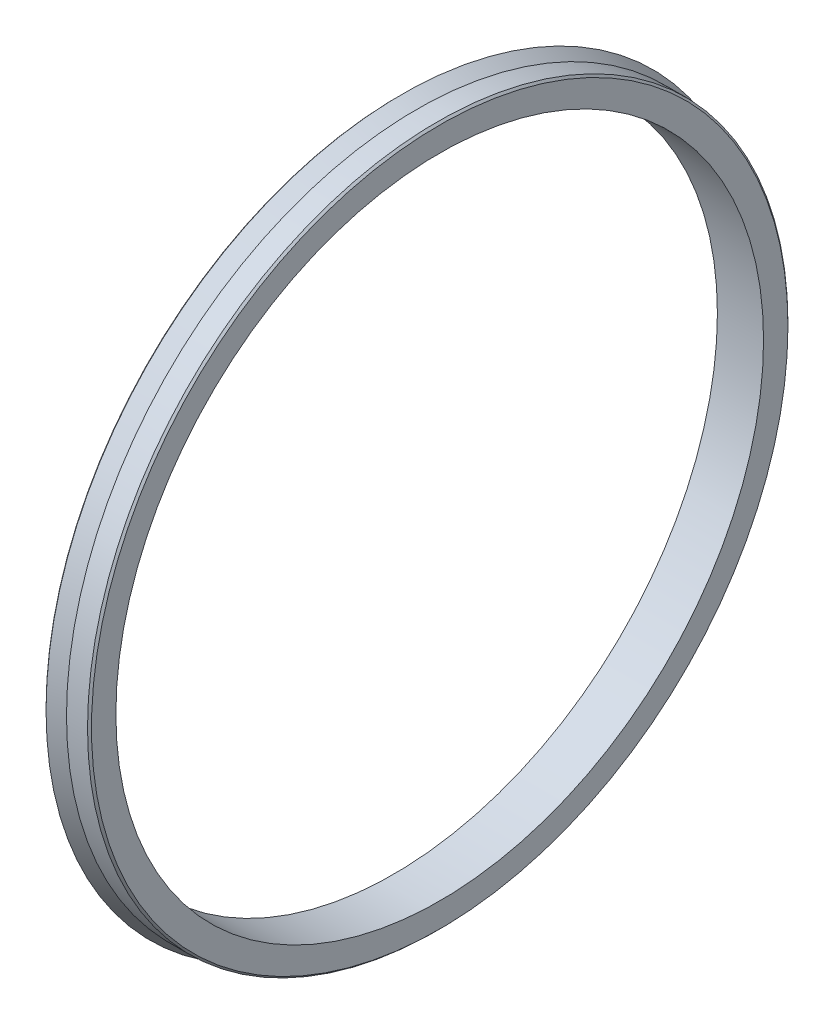
ISO-10303-21;
HEADER;
FILE_DESCRIPTION(('STEP AP214'),'2;1');
FILE_NAME('part.step','',(''),(''),'','','');
FILE_SCHEMA(('AUTOMOTIVE_DESIGN { 1 0 10303 214 1 1 1 1 }'));
ENDSEC;
DATA;
#1=APPLICATION_CONTEXT('core data for automotive mechanical design processes');
#2=APPLICATION_PROTOCOL_DEFINITION('international standard','automotive_design',2000,#1);
#3=PRODUCT_CONTEXT('',#1,'mechanical');
#4=PRODUCT('Part','Part','',(#3));
#5=PRODUCT_RELATED_PRODUCT_CATEGORY('part','',(#4));
#6=PRODUCT_DEFINITION_FORMATION('','',#4);
#7=PRODUCT_DEFINITION_CONTEXT('part definition',#1,'design');
#8=PRODUCT_DEFINITION('design','',#6,#7);
#9=PRODUCT_DEFINITION_SHAPE('','',#8);
#10=(LENGTH_UNIT() NAMED_UNIT(*) SI_UNIT(.MILLI.,.METRE.));
#11=(NAMED_UNIT(*) PLANE_ANGLE_UNIT() SI_UNIT($,.RADIAN.));
#12=(NAMED_UNIT(*) SI_UNIT($,.STERADIAN.) SOLID_ANGLE_UNIT());
#13=UNCERTAINTY_MEASURE_WITH_UNIT(LENGTH_MEASURE(1.E-05),#10,'distance_accuracy_value','');
#14=(GEOMETRIC_REPRESENTATION_CONTEXT(3) GLOBAL_UNCERTAINTY_ASSIGNED_CONTEXT((#13)) GLOBAL_UNIT_ASSIGNED_CONTEXT((#10,
#11,#12)) REPRESENTATION_CONTEXT('',''));
#15=CARTESIAN_POINT('',(0.,0.,0.));
#16=DIRECTION('',(0.,0.,1.));
#17=DIRECTION('',(1.,0.,0.));
#18=AXIS2_PLACEMENT_3D('',#15,#16,#17);
#19=CARTESIAN_POINT('',(4.,-49.11,0.));
#20=DIRECTION('',(1.,0.,0.));
#21=DIRECTION('',(0.,0.,-1.));
#22=AXIS2_PLACEMENT_3D('',#19,#20,#21);
#23=TOROIDAL_SURFACE('',#22,51.11,0.800000000000001);
#24=CARTESIAN_POINT('',(4.29203142293957,-49.11,0.));
#25=DIRECTION('',(1.,0.,0.));
#26=DIRECTION('',(0.,0.,-1.));
#27=AXIS2_PLACEMENT_3D('',#24,#25,#26);
#28=CIRCLE('',#27,51.8547936949356);
#29=CARTESIAN_POINT('',(4.29203142293957,-49.11,-51.8547936949356));
#30=VERTEX_POINT('',#29);
#31=EDGE_CURVE('E100',#30,#30,#28,.T.);
#32=ORIENTED_EDGE('',*,*,#31,.F.);
#33=EDGE_LOOP('',(#32));
#34=FACE_BOUND('',#33,.T.);
#35=CARTESIAN_POINT('',(4.,-49.11,0.));
#36=DIRECTION('',(1.,0.,0.));
#37=DIRECTION('',(0.,0.,-1.));
#38=AXIS2_PLACEMENT_3D('',#35,#36,#37);
#39=CIRCLE('',#38,50.31);
#40=CARTESIAN_POINT('',(4.,-49.11,-50.31));
#41=VERTEX_POINT('',#40);
#42=EDGE_CURVE('E72',#41,#41,#39,.T.);
#43=ORIENTED_EDGE('',*,*,#42,.T.);
#44=EDGE_LOOP('',(#43));
#45=FACE_BOUND('',#44,.T.);
#46=ADVANCED_FACE('F47',(#34,#45),#23,.F.);
#47=CARTESIAN_POINT('',(0.,-49.11,0.));
#48=DIRECTION('',(1.,0.,0.));
#49=DIRECTION('',(0.,0.,-1.));
#50=AXIS2_PLACEMENT_3D('',#47,#48,#49);
#51=CONICAL_SURFACE('',#50,50.11,0.0499583957219425);
#52=ORIENTED_EDGE('',*,*,#42,.F.);
#53=EDGE_LOOP('',(#52));
#54=FACE_BOUND('',#53,.T.);
#55=CARTESIAN_POINT('',(0.,-49.11,0.));
#56=DIRECTION('',(1.,0.,0.));
#57=DIRECTION('',(0.,0.,-1.));
#58=AXIS2_PLACEMENT_3D('',#55,#56,#57);
#59=CIRCLE('',#58,50.11);
#60=CARTESIAN_POINT('',(0.,-49.11,-50.11));
#61=VERTEX_POINT('',#60);
#62=EDGE_CURVE('E76',#61,#61,#59,.T.);
#63=ORIENTED_EDGE('',*,*,#62,.T.);
#64=EDGE_LOOP('',(#63));
#65=FACE_BOUND('',#64,.T.);
#66=ADVANCED_FACE('F110',(#54,#65),#51,.T.);
#67=CARTESIAN_POINT('',(0.,0.,0.));
#68=DIRECTION('',(1.,0.,0.));
#69=DIRECTION('',(0.,0.,-1.));
#70=AXIS2_PLACEMENT_3D('',#67,#68,#69);
#71=PLANE('',#70);
#72=ORIENTED_EDGE('',*,*,#62,.F.);
#73=EDGE_LOOP('',(#72));
#74=FACE_BOUND('',#73,.T.);
#75=CARTESIAN_POINT('',(0.,-49.11,0.));
#76=DIRECTION('',(1.,0.,0.));
#77=DIRECTION('',(0.,0.,-1.));
#78=AXIS2_PLACEMENT_3D('',#75,#76,#77);
#79=CIRCLE('',#78,49.11);
#80=CARTESIAN_POINT('',(0.,-49.11,-49.11));
#81=VERTEX_POINT('',#80);
#82=EDGE_CURVE('E80',#81,#81,#79,.T.);
#83=ORIENTED_EDGE('',*,*,#82,.T.);
#84=EDGE_LOOP('',(#83));
#85=FACE_BOUND('',#84,.T.);
#86=ADVANCED_FACE('F116',(#74,#85),#71,.F.);
#87=CARTESIAN_POINT('',(7.00000000000001,-49.11,0.));
#88=DIRECTION('',(1.,0.,0.));
#89=DIRECTION('',(0.,0.,-1.));
#90=AXIS2_PLACEMENT_3D('',#87,#88,#89);
#91=CYLINDRICAL_SURFACE('',#90,49.11);
#92=CARTESIAN_POINT('',(7.,-49.11,0.));
#93=DIRECTION('',(1.,0.,0.));
#94=DIRECTION('',(0.,0.,-1.));
#95=AXIS2_PLACEMENT_3D('',#92,#93,#94);
#96=CIRCLE('',#95,49.11);
#97=CARTESIAN_POINT('',(7.,-49.11,-49.11));
#98=VERTEX_POINT('',#97);
#99=EDGE_CURVE('E84',#98,#98,#96,.T.);
#100=ORIENTED_EDGE('',*,*,#99,.T.);
#101=EDGE_LOOP('',(#100));
#102=FACE_BOUND('',#101,.T.);
#103=ORIENTED_EDGE('',*,*,#82,.F.);
#104=EDGE_LOOP('',(#103));
#105=FACE_BOUND('',#104,.T.);
#106=ADVANCED_FACE('F122',(#102,#105),#91,.F.);
#107=CARTESIAN_POINT('',(7.,0.,0.));
#108=DIRECTION('',(1.,0.,0.));
#109=DIRECTION('',(0.,0.,-1.));
#110=AXIS2_PLACEMENT_3D('',#107,#108,#109);
#111=PLANE('',#110);
#112=CARTESIAN_POINT('',(7.,-49.11,0.));
#113=DIRECTION('',(1.,0.,0.));
#114=DIRECTION('',(0.,0.,-1.));
#115=AXIS2_PLACEMENT_3D('',#112,#113,#114);
#116=CIRCLE('',#115,52.81);
#117=CARTESIAN_POINT('',(7.,-49.11,-52.81));
#118=VERTEX_POINT('',#117);
#119=EDGE_CURVE('E66',#118,#118,#116,.T.);
#120=ORIENTED_EDGE('',*,*,#119,.T.);
#121=EDGE_LOOP('',(#120));
#122=FACE_BOUND('',#121,.T.);
#123=ORIENTED_EDGE('',*,*,#99,.F.);
#124=EDGE_LOOP('',(#123));
#125=FACE_BOUND('',#124,.T.);
#126=ADVANCED_FACE('F127',(#122,#125),#111,.T.);
#127=CARTESIAN_POINT('',(7.00000000000001,-49.11,0.));
#128=DIRECTION('',(1.,0.,0.));
#129=DIRECTION('',(0.,0.,-1.));
#130=AXIS2_PLACEMENT_3D('',#127,#128,#129);
#131=CYLINDRICAL_SURFACE('',#130,53.11);
#132=CARTESIAN_POINT('',(6.7,-49.11,0.));
#133=DIRECTION('',(1.,0.,0.));
#134=DIRECTION('',(0.,0.,-1.));
#135=AXIS2_PLACEMENT_3D('',#132,#133,#134);
#136=CIRCLE('',#135,53.11);
#137=CARTESIAN_POINT('',(6.7,-49.11,-53.11));
#138=VERTEX_POINT('',#137);
#139=EDGE_CURVE('E61',#138,#138,#136,.F.);
#140=ORIENTED_EDGE('',*,*,#139,.T.);
#141=EDGE_LOOP('',(#140));
#142=FACE_BOUND('',#141,.T.);
#143=CARTESIAN_POINT('',(3.51,-49.11,0.));
#144=DIRECTION('',(1.,0.,0.));
#145=DIRECTION('',(0.,0.,-1.));
#146=AXIS2_PLACEMENT_3D('',#143,#144,#145);
#147=CIRCLE('',#146,53.11);
#148=CARTESIAN_POINT('',(3.51,-49.11,-53.11));
#149=VERTEX_POINT('',#148);
#150=EDGE_CURVE('E88',#149,#149,#147,.T.);
#151=ORIENTED_EDGE('',*,*,#150,.T.);
#152=EDGE_LOOP('',(#151));
#153=FACE_BOUND('',#152,.T.);
#154=ADVANCED_FACE('F134',(#142,#153),#131,.T.);
#155=CARTESIAN_POINT('',(3.51,-49.11,0.));
#156=DIRECTION('',(-1.,0.,0.));
#157=DIRECTION('',(0.,0.,1.));
#158=AXIS2_PLACEMENT_3D('',#155,#156,#157);
#159=CONICAL_SURFACE('',#158,53.11,0.340750642998031);
#160=CARTESIAN_POINT('',(1.2214705882353,-49.11,0.));
#161=DIRECTION('',(1.,0.,0.));
#162=DIRECTION('',(0.,0.,-1.));
#163=AXIS2_PLACEMENT_3D('',#160,#161,#162);
#164=CIRCLE('',#163,53.9214705882353);
#165=CARTESIAN_POINT('',(1.2214705882353,-49.11,-53.9214705882353));
#166=VERTEX_POINT('',#165);
#167=EDGE_CURVE('E56',#166,#166,#164,.T.);
#168=ORIENTED_EDGE('',*,*,#167,.T.);
#169=EDGE_LOOP('',(#168));
#170=FACE_BOUND('',#169,.T.);
#171=ORIENTED_EDGE('',*,*,#150,.F.);
#172=EDGE_LOOP('',(#171));
#173=FACE_BOUND('',#172,.T.);
#174=ADVANCED_FACE('F160',(#170,#173),#159,.T.);
#175=CARTESIAN_POINT('',(1.,0.,0.));
#176=DIRECTION('',(-1.,0.,0.));
#177=DIRECTION('',(0.,0.,1.));
#178=AXIS2_PLACEMENT_3D('',#175,#176,#177);
#179=PLANE('',#178);
#180=CARTESIAN_POINT('',(1.,-49.11,0.));
#181=DIRECTION('',(-1.,0.,0.));
#182=DIRECTION('',(0.,0.,1.));
#183=AXIS2_PLACEMENT_3D('',#180,#181,#182);
#184=CIRCLE('',#183,53.7);
#185=CARTESIAN_POINT('',(1.,-49.11,-53.7));
#186=VERTEX_POINT('',#185);
#187=EDGE_CURVE('E10',#186,#186,#184,.T.);
#188=ORIENTED_EDGE('',*,*,#187,.T.);
#189=EDGE_LOOP('',(#188));
#190=FACE_BOUND('',#189,.T.);
#191=CARTESIAN_POINT('',(1.,-49.11,0.));
#192=DIRECTION('',(1.,0.,0.));
#193=DIRECTION('',(0.,0.,-1.));
#194=AXIS2_PLACEMENT_3D('',#191,#192,#193);
#195=CIRCLE('',#194,53.486602499974);
#196=CARTESIAN_POINT('',(1.,-49.11,-53.486602499974));
#197=VERTEX_POINT('',#196);
#198=EDGE_CURVE('E92',#197,#197,#195,.T.);
#199=ORIENTED_EDGE('',*,*,#198,.T.);
#200=EDGE_LOOP('',(#199));
#201=FACE_BOUND('',#200,.T.);
#202=ADVANCED_FACE('F163',(#190,#201),#179,.T.);
#203=CARTESIAN_POINT('',(1.5,-49.11,0.));
#204=DIRECTION('',(1.,0.,0.));
#205=DIRECTION('',(0.,0.,-1.));
#206=AXIS2_PLACEMENT_3D('',#203,#204,#205);
#207=TOROIDAL_SURFACE('',#206,53.486602499974,0.5);
#208=CARTESIAN_POINT('',(1.31748036066277,-49.11,0.));
#209=DIRECTION('',(1.,0.,0.));
#210=DIRECTION('',(0.,0.,-1.));
#211=AXIS2_PLACEMENT_3D('',#208,#209,#210);
#212=CIRCLE('',#211,53.0211064406392);
#213=CARTESIAN_POINT('',(1.31748036066277,-49.11,-53.0211064406392));
#214=VERTEX_POINT('',#213);
#215=EDGE_CURVE('E96',#214,#214,#212,.T.);
#216=ORIENTED_EDGE('',*,*,#215,.T.);
#217=EDGE_LOOP('',(#216));
#218=FACE_BOUND('',#217,.T.);
#219=ORIENTED_EDGE('',*,*,#198,.F.);
#220=EDGE_LOOP('',(#219));
#221=FACE_BOUND('',#220,.T.);
#222=ADVANCED_FACE('F151',(#218,#221),#207,.T.);
#223=CARTESIAN_POINT('',(1.31748036066277,-49.11,0.));
#224=DIRECTION('',(-1.,0.,0.));
#225=DIRECTION('',(0.,0.,1.));
#226=AXIS2_PLACEMENT_3D('',#223,#224,#225);
#227=CONICAL_SURFACE('',#226,53.0211064406392,0.373674992851978);
#228=ORIENTED_EDGE('',*,*,#31,.T.);
#229=EDGE_LOOP('',(#228));
#230=FACE_BOUND('',#229,.T.);
#231=ORIENTED_EDGE('',*,*,#215,.F.);
#232=EDGE_LOOP('',(#231));
#233=FACE_BOUND('',#232,.T.);
#234=ADVANCED_FACE('F105',(#230,#233),#227,.F.);
#235=CARTESIAN_POINT('',(7.,-49.11,0.));
#236=DIRECTION('',(-1.,0.,0.));
#237=DIRECTION('',(0.,0.,1.));
#238=AXIS2_PLACEMENT_3D('',#235,#236,#237);
#239=CONICAL_SURFACE('',#238,52.81,0.78539816339746);
#240=ORIENTED_EDGE('',*,*,#139,.F.);
#241=EDGE_LOOP('',(#240));
#242=FACE_BOUND('',#241,.T.);
#243=ORIENTED_EDGE('',*,*,#119,.F.);
#244=EDGE_LOOP('',(#243));
#245=FACE_BOUND('',#244,.T.);
#246=ADVANCED_FACE('F139',(#242,#245),#239,.T.);
#247=CARTESIAN_POINT('',(1.22147058823529,-49.11,0.));
#248=DIRECTION('',(1.,0.,0.));
#249=DIRECTION('',(0.,0.,-1.));
#250=AXIS2_PLACEMENT_3D('',#247,#248,#249);
#251=CONICAL_SURFACE('',#250,53.9214705882353,0.785398163397495);
#252=CARTESIAN_POINT('',(1.,-49.11,-53.7));
#253=CARTESIAN_POINT('',(1.00230698529412,-49.11,-53.7023069852941));
#254=CARTESIAN_POINT('',(1.00461397058824,-49.11,-53.7046139705882));
#255=CARTESIAN_POINT('',(1.00922794117647,-49.11,-53.7092279411765));
#256=CARTESIAN_POINT('',(1.01153492647059,-49.11,-53.7115349264706));
#257=CARTESIAN_POINT('',(1.01614889705882,-49.11,-53.7161488970588));
#258=CARTESIAN_POINT('',(1.01845588235294,-49.11,-53.7184558823529));
#259=CARTESIAN_POINT('',(1.02306985294118,-49.11,-53.7230698529412));
#260=CARTESIAN_POINT('',(1.02537683823529,-49.11,-53.7253768382353));
#261=CARTESIAN_POINT('',(1.02999080882353,-49.11,-53.7299908088235));
#262=CARTESIAN_POINT('',(1.03229779411765,-49.11,-53.7322977941176));
#263=CARTESIAN_POINT('',(1.03691176470588,-49.11,-53.7369117647059));
#264=CARTESIAN_POINT('',(1.03921875,-49.11,-53.73921875));
#265=CARTESIAN_POINT('',(1.04383272058824,-49.11,-53.7438327205882));
#266=CARTESIAN_POINT('',(1.04613970588235,-49.11,-53.7461397058823));
#267=CARTESIAN_POINT('',(1.05075367647059,-49.11,-53.7507536764706));
#268=CARTESIAN_POINT('',(1.05306066176471,-49.11,-53.7530606617647));
#269=CARTESIAN_POINT('',(1.05767463235294,-49.11,-53.7576746323529));
#270=CARTESIAN_POINT('',(1.05998161764706,-49.11,-53.759981617647));
#271=CARTESIAN_POINT('',(1.06459558823529,-49.11,-53.7645955882353));
#272=CARTESIAN_POINT('',(1.06690257352941,-49.11,-53.7669025735294));
#273=CARTESIAN_POINT('',(1.07151654411765,-49.11,-53.7715165441176));
#274=CARTESIAN_POINT('',(1.07382352941177,-49.11,-53.7738235294118));
#275=CARTESIAN_POINT('',(1.0784375,-49.11,-53.7784375));
#276=CARTESIAN_POINT('',(1.08074448529412,-49.11,-53.7807444852941));
#277=CARTESIAN_POINT('',(1.08535845588235,-49.11,-53.7853584558823));
#278=CARTESIAN_POINT('',(1.08766544117647,-49.11,-53.7876654411765));
#279=CARTESIAN_POINT('',(1.09227941176471,-49.11,-53.7922794117647));
#280=CARTESIAN_POINT('',(1.09458639705882,-49.11,-53.7945863970588));
#281=CARTESIAN_POINT('',(1.09920036764706,-49.11,-53.7992003676471));
#282=CARTESIAN_POINT('',(1.10150735294118,-49.11,-53.8015073529412));
#283=CARTESIAN_POINT('',(1.10612132352941,-49.11,-53.8061213235294));
#284=CARTESIAN_POINT('',(1.10842830882353,-49.11,-53.8084283088235));
#285=CARTESIAN_POINT('',(1.11304227941177,-49.11,-53.8130422794118));
#286=CARTESIAN_POINT('',(1.11534926470588,-49.11,-53.8153492647059));
#287=CARTESIAN_POINT('',(1.11996323529412,-49.11,-53.8199632352941));
#288=CARTESIAN_POINT('',(1.12227022058824,-49.11,-53.8222702205882));
#289=CARTESIAN_POINT('',(1.12688419117647,-49.11,-53.8268841911765));
#290=CARTESIAN_POINT('',(1.12919117647059,-49.11,-53.8291911764706));
#291=CARTESIAN_POINT('',(1.13380514705882,-49.11,-53.8338051470588));
#292=CARTESIAN_POINT('',(1.13611213235294,-49.11,-53.8361121323529));
#293=CARTESIAN_POINT('',(1.14072610294118,-49.11,-53.8407261029412));
#294=CARTESIAN_POINT('',(1.1430330882353,-49.11,-53.8430330882353));
#295=CARTESIAN_POINT('',(1.14764705882353,-49.11,-53.8476470588235));
#296=CARTESIAN_POINT('',(1.14995404411765,-49.11,-53.8499540441176));
#297=CARTESIAN_POINT('',(1.15456801470588,-49.11,-53.8545680147059));
#298=CARTESIAN_POINT('',(1.156875,-49.11,-53.856875));
#299=CARTESIAN_POINT('',(1.16148897058824,-49.11,-53.8614889705882));
#300=CARTESIAN_POINT('',(1.16379595588235,-49.11,-53.8637959558824));
#301=CARTESIAN_POINT('',(1.16840992647059,-49.11,-53.8684099264706));
#302=CARTESIAN_POINT('',(1.17071691176471,-49.11,-53.8707169117647));
#303=CARTESIAN_POINT('',(1.17533088235294,-49.11,-53.8753308823529));
#304=CARTESIAN_POINT('',(1.17763786764706,-49.11,-53.8776378676471));
#305=CARTESIAN_POINT('',(1.1822518382353,-49.11,-53.8822518382353));
#306=CARTESIAN_POINT('',(1.18455882352941,-49.11,-53.8845588235294));
#307=CARTESIAN_POINT('',(1.18917279411765,-49.11,-53.8891727941177));
#308=CARTESIAN_POINT('',(1.19147977941177,-49.11,-53.8914797794118));
#309=CARTESIAN_POINT('',(1.19609375,-49.11,-53.89609375));
#310=CARTESIAN_POINT('',(1.19840073529412,-49.11,-53.8984007352941));
#311=CARTESIAN_POINT('',(1.20301470588235,-49.11,-53.9030147058824));
#312=CARTESIAN_POINT('',(1.20532169117647,-49.11,-53.9053216911765));
#313=CARTESIAN_POINT('',(1.20993566176471,-49.11,-53.9099356617647));
#314=CARTESIAN_POINT('',(1.21224264705883,-49.11,-53.9122426470588));
#315=CARTESIAN_POINT('',(1.21685661764706,-49.11,-53.9168566176471));
#316=CARTESIAN_POINT('',(1.21916360294118,-49.11,-53.9191636029412));
#317=CARTESIAN_POINT('',(1.2214705882353,-49.11,-53.9214705882353));
#318=B_SPLINE_CURVE_WITH_KNOTS('',3,(#252,#253,#254,#255,#256,#257,#258,#259,#260,#261,#262,
#263,#264,#265,#266,#267,#268,#269,#270,#271,#272,#273,#274,#275,#276,#277,#278,#279,#280,#281,
#282,#283,#284,#285,#286,#287,#288,#289,#290,#291,#292,#293,#294,#295,#296,#297,#298,#299,#300,
#301,#302,#303,#304,#305,#306,#307,#308,#309,#310,#311,#312,#313,#314,#315,#316,#317),
.UNSPECIFIED.,.F.,.F.,(4,2,2,2,2,2,2,2,2,2,2,2,2,2,2,2,2,2,2,2,2,2,2,2,2,2,2,2,2,2,2,2,4),(0.,
0.00978770967340943,0.0195754193468189,0.0293631290202283,0.0391508386936377,0.0489385483670471,
0.0587262580404615,0.0685139677138709,0.0783016773872803,0.0880893870606899,0.0978770967340993,
0.107664806407509,0.117452516080918,0.127240225754328,0.137027935427737,0.146815645101146,
0.156603354774561,0.16639106444797,0.17617877412138,0.185966483794789,0.195754193468199,
0.205541903141608,0.215329612815018,0.225117322488427,0.234905032161836,0.244692741835246,
0.25448045150866,0.26426816118207,0.274055870855479,0.283843580528888,0.293631290202298,
0.303418999875707,0.313206709549117),.UNSPECIFIED.);
#319=EDGE_CURVE('BSEAM50',#186,#166,#318,.T.);
#320=ORIENTED_EDGE('',*,*,#187,.F.);
#321=ORIENTED_EDGE('',*,*,#167,.F.);
#322=ORIENTED_EDGE('',*,*,#319,.T.);
#323=ORIENTED_EDGE('',*,*,#319,.F.);
#324=EDGE_LOOP('',(#320,#322,#321,#323));
#325=FACE_BOUND('',#324,.T.);
#326=ADVANCED_FACE('F50',(#325),#251,.T.);
#327=CLOSED_SHELL('',(#46,#66,#86,#106,#126,#154,#174,#202,#222,#234,#246,#326));
#328=MANIFOLD_SOLID_BREP('B2',#327);
#329=ADVANCED_BREP_SHAPE_REPRESENTATION('',(#18,#328),#14);
#330=SHAPE_DEFINITION_REPRESENTATION(#9,#329);
ENDSEC;
END-ISO-10303-21;
